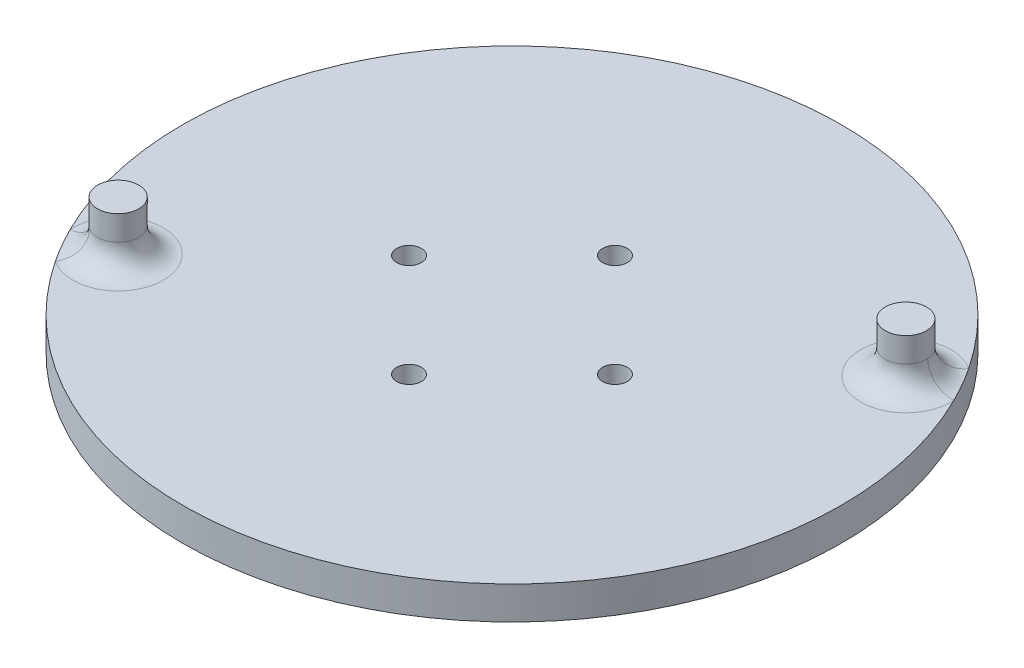
ISO-10303-21;
HEADER;
FILE_DESCRIPTION(('STEP AP214'),'2;1');
FILE_NAME('part.step','',(''),(''),'','','');
FILE_SCHEMA(('AUTOMOTIVE_DESIGN { 1 0 10303 214 1 1 1 1 }'));
ENDSEC;
DATA;
#1=APPLICATION_CONTEXT('core data for automotive mechanical design processes');
#2=APPLICATION_PROTOCOL_DEFINITION('international standard','automotive_design',2000,#1);
#3=PRODUCT_CONTEXT('',#1,'mechanical');
#4=PRODUCT('Part','Part','',(#3));
#5=PRODUCT_RELATED_PRODUCT_CATEGORY('part','',(#4));
#6=PRODUCT_DEFINITION_FORMATION('','',#4);
#7=PRODUCT_DEFINITION_CONTEXT('part definition',#1,'design');
#8=PRODUCT_DEFINITION('design','',#6,#7);
#9=PRODUCT_DEFINITION_SHAPE('','',#8);
#10=(LENGTH_UNIT() NAMED_UNIT(*) SI_UNIT(.MILLI.,.METRE.));
#11=(NAMED_UNIT(*) PLANE_ANGLE_UNIT() SI_UNIT($,.RADIAN.));
#12=(NAMED_UNIT(*) SI_UNIT($,.STERADIAN.) SOLID_ANGLE_UNIT());
#13=UNCERTAINTY_MEASURE_WITH_UNIT(LENGTH_MEASURE(1.E-05),#10,'distance_accuracy_value','');
#14=(GEOMETRIC_REPRESENTATION_CONTEXT(3) GLOBAL_UNCERTAINTY_ASSIGNED_CONTEXT((#13)) GLOBAL_UNIT_ASSIGNED_CONTEXT((#10,
#11,#12)) REPRESENTATION_CONTEXT('',''));
#15=CARTESIAN_POINT('',(0.,0.,0.));
#16=DIRECTION('',(0.,0.,1.));
#17=DIRECTION('',(1.,0.,0.));
#18=AXIS2_PLACEMENT_3D('',#15,#16,#17);
#19=CARTESIAN_POINT('',(0.,4.,0.));
#20=DIRECTION('',(0.,1.,0.));
#21=DIRECTION('',(0.,0.,1.));
#22=AXIS2_PLACEMENT_3D('',#19,#20,#21);
#23=PLANE('',#22);
#24=CARTESIAN_POINT('',(0.,4.,-12.5));
#25=DIRECTION('',(0.,1.,0.));
#26=DIRECTION('',(0.,0.,1.));
#27=AXIS2_PLACEMENT_3D('',#24,#25,#26);
#28=CIRCLE('',#27,1.5);
#29=CARTESIAN_POINT('',(0.,4.,-11.));
#30=VERTEX_POINT('',#29);
#31=EDGE_CURVE('E182',#30,#30,#28,.T.);
#32=ORIENTED_EDGE('',*,*,#31,.F.);
#33=EDGE_LOOP('',(#32));
#34=FACE_BOUND('',#33,.T.);
#35=CARTESIAN_POINT('',(0.,4.,12.5));
#36=DIRECTION('',(0.,1.,0.));
#37=DIRECTION('',(0.,0.,1.));
#38=AXIS2_PLACEMENT_3D('',#35,#36,#37);
#39=CIRCLE('',#38,1.5);
#40=CARTESIAN_POINT('',(0.,4.,14.));
#41=VERTEX_POINT('',#40);
#42=EDGE_CURVE('E194',#41,#41,#39,.T.);
#43=ORIENTED_EDGE('',*,*,#42,.F.);
#44=EDGE_LOOP('',(#43));
#45=FACE_BOUND('',#44,.T.);
#46=CARTESIAN_POINT('',(0.,4.,0.));
#47=DIRECTION('',(0.,1.,0.));
#48=DIRECTION('',(0.,0.,1.));
#49=AXIS2_PLACEMENT_3D('',#46,#47,#48);
#50=CIRCLE('',#49,40.);
#51=CARTESIAN_POINT('',(33.351893608478,4.,-22.0828257414843));
#52=VERTEX_POINT('',#51);
#53=CARTESIAN_POINT('',(-35.8002348837093,4.,17.8421742585159));
#54=VERTEX_POINT('',#53);
#55=EDGE_CURVE('E200',#52,#54,#50,.T.);
#56=ORIENTED_EDGE('',*,*,#55,.T.);
#57=CARTESIAN_POINT('',(-30.3108891324554,4.,17.4999999999999));
#58=DIRECTION('',(0.,1.,0.));
#59=DIRECTION('',(0.,0.,1.));
#60=AXIS2_PLACEMENT_3D('',#57,#58,#59);
#61=CIRCLE('',#60,5.5);
#62=CARTESIAN_POINT('',(-33.3518936084782,4.,22.082825741484));
#63=VERTEX_POINT('',#62);
#64=EDGE_CURVE('E105',#54,#63,#61,.F.);
#65=ORIENTED_EDGE('',*,*,#64,.T.);
#66=CARTESIAN_POINT('',(35.8002348837092,4.,-17.842174258516));
#67=VERTEX_POINT('',#66);
#68=EDGE_CURVE('E201',#63,#67,#50,.T.);
#69=ORIENTED_EDGE('',*,*,#68,.T.);
#70=CARTESIAN_POINT('',(30.3108891324553,4.,-17.5000000000002));
#71=DIRECTION('',(0.,1.,0.));
#72=DIRECTION('',(0.,0.,1.));
#73=AXIS2_PLACEMENT_3D('',#70,#71,#72);
#74=CIRCLE('',#73,5.5);
#75=EDGE_CURVE('E103',#67,#52,#74,.F.);
#76=ORIENTED_EDGE('',*,*,#75,.T.);
#77=EDGE_LOOP('',(#56,#65,#69,#76));
#78=FACE_BOUND('',#77,.T.);
#79=CARTESIAN_POINT('',(-12.5,4.,0.));
#80=DIRECTION('',(0.,1.,0.));
#81=DIRECTION('',(0.,0.,1.));
#82=AXIS2_PLACEMENT_3D('',#79,#80,#81);
#83=CIRCLE('',#82,1.5);
#84=CARTESIAN_POINT('',(-12.5,4.,1.49999999999996));
#85=VERTEX_POINT('',#84);
#86=EDGE_CURVE('E188',#85,#85,#83,.T.);
#87=ORIENTED_EDGE('',*,*,#86,.F.);
#88=EDGE_LOOP('',(#87));
#89=FACE_BOUND('',#88,.T.);
#90=CARTESIAN_POINT('',(12.5,4.,1.30930550206618E-13));
#91=DIRECTION('',(0.,1.,0.));
#92=DIRECTION('',(0.,0.,1.));
#93=AXIS2_PLACEMENT_3D('',#90,#91,#92);
#94=CIRCLE('',#93,1.5);
#95=CARTESIAN_POINT('',(12.5,4.,1.50000000000013));
#96=VERTEX_POINT('',#95);
#97=EDGE_CURVE('E176',#96,#96,#94,.T.);
#98=ORIENTED_EDGE('',*,*,#97,.F.);
#99=EDGE_LOOP('',(#98));
#100=FACE_BOUND('',#99,.T.);
#101=ADVANCED_FACE('F35',(#34,#45,#78,#89,#100),#23,.T.);
#102=CARTESIAN_POINT('',(0.,0.,0.));
#103=DIRECTION('',(0.,1.,0.));
#104=DIRECTION('',(0.,0.,1.));
#105=AXIS2_PLACEMENT_3D('',#102,#103,#104);
#106=PLANE('',#105);
#107=CARTESIAN_POINT('',(0.,0.,0.));
#108=DIRECTION('',(0.,1.,0.));
#109=DIRECTION('',(0.,0.,1.));
#110=AXIS2_PLACEMENT_3D('',#107,#108,#109);
#111=CIRCLE('',#110,40.);
#112=CARTESIAN_POINT('',(0.,0.,40.));
#113=VERTEX_POINT('',#112);
#114=EDGE_CURVE('E197',#113,#113,#111,.T.);
#115=ORIENTED_EDGE('',*,*,#114,.F.);
#116=EDGE_LOOP('',(#115));
#117=FACE_BOUND('',#116,.T.);
#118=CARTESIAN_POINT('',(0.,0.,12.5));
#119=DIRECTION('',(0.,1.,0.));
#120=DIRECTION('',(0.,0.,1.));
#121=AXIS2_PLACEMENT_3D('',#118,#119,#120);
#122=CIRCLE('',#121,1.5);
#123=CARTESIAN_POINT('',(0.,0.,14.));
#124=VERTEX_POINT('',#123);
#125=EDGE_CURVE('E191',#124,#124,#122,.T.);
#126=ORIENTED_EDGE('',*,*,#125,.T.);
#127=EDGE_LOOP('',(#126));
#128=FACE_BOUND('',#127,.T.);
#129=CARTESIAN_POINT('',(-12.5,0.,0.));
#130=DIRECTION('',(0.,1.,0.));
#131=DIRECTION('',(0.,0.,1.));
#132=AXIS2_PLACEMENT_3D('',#129,#130,#131);
#133=CIRCLE('',#132,1.5);
#134=CARTESIAN_POINT('',(-12.5,0.,1.49999999999996));
#135=VERTEX_POINT('',#134);
#136=EDGE_CURVE('E185',#135,#135,#133,.T.);
#137=ORIENTED_EDGE('',*,*,#136,.T.);
#138=EDGE_LOOP('',(#137));
#139=FACE_BOUND('',#138,.T.);
#140=CARTESIAN_POINT('',(0.,0.,-12.5));
#141=DIRECTION('',(0.,1.,0.));
#142=DIRECTION('',(0.,0.,1.));
#143=AXIS2_PLACEMENT_3D('',#140,#141,#142);
#144=CIRCLE('',#143,1.5);
#145=CARTESIAN_POINT('',(0.,0.,-11.));
#146=VERTEX_POINT('',#145);
#147=EDGE_CURVE('E179',#146,#146,#144,.T.);
#148=ORIENTED_EDGE('',*,*,#147,.T.);
#149=EDGE_LOOP('',(#148));
#150=FACE_BOUND('',#149,.T.);
#151=CARTESIAN_POINT('',(12.5,0.,1.30930550206618E-13));
#152=DIRECTION('',(0.,1.,0.));
#153=DIRECTION('',(0.,0.,1.));
#154=AXIS2_PLACEMENT_3D('',#151,#152,#153);
#155=CIRCLE('',#154,1.5);
#156=CARTESIAN_POINT('',(12.5,0.,1.50000000000013));
#157=VERTEX_POINT('',#156);
#158=EDGE_CURVE('E173',#157,#157,#155,.T.);
#159=ORIENTED_EDGE('',*,*,#158,.T.);
#160=EDGE_LOOP('',(#159));
#161=FACE_BOUND('',#160,.T.);
#162=ADVANCED_FACE('F224',(#117,#128,#139,#150,#161),#106,.F.);
#163=CARTESIAN_POINT('',(0.,4.,0.));
#164=DIRECTION('',(0.,-1.,0.));
#165=DIRECTION('',(0.,0.,-1.));
#166=AXIS2_PLACEMENT_3D('',#163,#164,#165);
#167=CYLINDRICAL_SURFACE('',#166,40.);
#168=EDGE_CURVE('E99',#67,#52,#50,.T.);
#169=ORIENTED_EDGE('',*,*,#168,.F.);
#170=ORIENTED_EDGE('',*,*,#68,.F.);
#171=EDGE_CURVE('E89',#54,#63,#50,.T.);
#172=ORIENTED_EDGE('',*,*,#171,.F.);
#173=ORIENTED_EDGE('',*,*,#55,.F.);
#174=EDGE_LOOP('',(#169,#170,#172,#173));
#175=FACE_BOUND('',#174,.T.);
#176=ORIENTED_EDGE('',*,*,#114,.T.);
#177=EDGE_LOOP('',(#176));
#178=FACE_BOUND('',#177,.T.);
#179=ADVANCED_FACE('F121',(#175,#178),#167,.T.);
#180=CARTESIAN_POINT('',(0.,4.,12.5));
#181=DIRECTION('',(0.,-1.,0.));
#182=DIRECTION('',(0.,0.,-1.));
#183=AXIS2_PLACEMENT_3D('',#180,#181,#182);
#184=CYLINDRICAL_SURFACE('',#183,1.5);
#185=ORIENTED_EDGE('',*,*,#42,.T.);
#186=EDGE_LOOP('',(#185));
#187=FACE_BOUND('',#186,.T.);
#188=ORIENTED_EDGE('',*,*,#125,.F.);
#189=EDGE_LOOP('',(#188));
#190=FACE_BOUND('',#189,.T.);
#191=ADVANCED_FACE('F234',(#187,#190),#184,.F.);
#192=CARTESIAN_POINT('',(-12.5,4.,0.));
#193=DIRECTION('',(0.,-1.,0.));
#194=DIRECTION('',(0.,0.,-1.));
#195=AXIS2_PLACEMENT_3D('',#192,#193,#194);
#196=CYLINDRICAL_SURFACE('',#195,1.5);
#197=ORIENTED_EDGE('',*,*,#86,.T.);
#198=EDGE_LOOP('',(#197));
#199=FACE_BOUND('',#198,.T.);
#200=ORIENTED_EDGE('',*,*,#136,.F.);
#201=EDGE_LOOP('',(#200));
#202=FACE_BOUND('',#201,.T.);
#203=ADVANCED_FACE('F238',(#199,#202),#196,.F.);
#204=CARTESIAN_POINT('',(0.,4.,-12.5));
#205=DIRECTION('',(0.,-1.,0.));
#206=DIRECTION('',(0.,0.,-1.));
#207=AXIS2_PLACEMENT_3D('',#204,#205,#206);
#208=CYLINDRICAL_SURFACE('',#207,1.5);
#209=ORIENTED_EDGE('',*,*,#31,.T.);
#210=EDGE_LOOP('',(#209));
#211=FACE_BOUND('',#210,.T.);
#212=ORIENTED_EDGE('',*,*,#147,.F.);
#213=EDGE_LOOP('',(#212));
#214=FACE_BOUND('',#213,.T.);
#215=ADVANCED_FACE('F241',(#211,#214),#208,.F.);
#216=CARTESIAN_POINT('',(12.5,4.,1.30930550206618E-13));
#217=DIRECTION('',(0.,-1.,0.));
#218=DIRECTION('',(0.,0.,-1.));
#219=AXIS2_PLACEMENT_3D('',#216,#217,#218);
#220=CYLINDRICAL_SURFACE('',#219,1.5);
#221=ORIENTED_EDGE('',*,*,#97,.T.);
#222=EDGE_LOOP('',(#221));
#223=FACE_BOUND('',#222,.T.);
#224=ORIENTED_EDGE('',*,*,#158,.F.);
#225=EDGE_LOOP('',(#224));
#226=FACE_BOUND('',#225,.T.);
#227=ADVANCED_FACE('F159',(#223,#226),#220,.F.);
#228=CARTESIAN_POINT('',(30.3108891324553,10.,-17.5000000000002));
#229=DIRECTION('',(0.,-1.,0.));
#230=DIRECTION('',(0.,0.,-1.));
#231=AXIS2_PLACEMENT_3D('',#228,#229,#230);
#232=CYLINDRICAL_SURFACE('',#231,2.5);
#233=CARTESIAN_POINT('',(30.3108891324553,7.,-17.5000000000002));
#234=DIRECTION('',(0.,1.,0.));
#235=DIRECTION('',(0.,0.,1.));
#236=AXIS2_PLACEMENT_3D('',#233,#234,#235);
#237=CIRCLE('',#236,2.5);
#238=CARTESIAN_POINT('',(31.6931638942838,7.,-19.5831026097657));
#239=VERTEX_POINT('',#238);
#240=CARTESIAN_POINT('',(32.8060462921161,7.,-17.655533753871));
#241=VERTEX_POINT('',#240);
#242=EDGE_CURVE('E48',#239,#241,#237,.T.);
#243=ORIENTED_EDGE('',*,*,#242,.T.);
#244=CARTESIAN_POINT('',(32.7900980421817,6.95988454325416,-17.1782498144012));
#245=CARTESIAN_POINT('',(32.829343833165,3.52855972586319,-17.4806537259757));
#246=CARTESIAN_POINT('',(36.2077537930057,4.,-16.9999578018618));
#247=CARTESIAN_POINT('',(32.7984393411925,6.97249814485793,-17.2424313256942));
#248=CARTESIAN_POINT('',(32.8216368819729,3.60357080085117,-17.4806354709631));
#249=CARTESIAN_POINT('',(36.1561172683221,4.,-17.1099477020297));
#250=CARTESIAN_POINT('',(32.8042797060119,6.98147980733672,-17.3070488288374));
#251=CARTESIAN_POINT('',(32.8175174351204,3.67515025466329,-17.4919603018832));
#252=CARTESIAN_POINT('',(36.1028997271764,4.,-17.2219815810571));
#253=CARTESIAN_POINT('',(32.8109228262008,6.99391764386403,-17.4366035244584));
#254=CARTESIAN_POINT('',(32.8122204232696,3.80803486217455,-17.5333343876834));
#255=CARTESIAN_POINT('',(35.9935810524816,4.,-17.4492955711121));
#256=CARTESIAN_POINT('',(32.8117297068167,6.99737834094753,-17.5015404114832));
#257=CARTESIAN_POINT('',(32.8109770688773,3.86965489312187,-17.5630207801374));
#258=CARTESIAN_POINT('',(35.9374823182773,4.,-17.5645729460346));
#259=CARTESIAN_POINT('',(32.8082857513596,7.00052590272815,-17.6312185903277));
#260=CARTESIAN_POINT('',(32.8072687742871,3.98178061009977,-17.6369613758325));
#261=CARTESIAN_POINT('',(35.8226561231657,4.,-17.7975894711439));
#262=CARTESIAN_POINT('',(32.8040403593206,7.00021682619641,-17.6959600174571));
#263=CARTESIAN_POINT('',(32.8048233500788,4.03260785485582,-17.6810121818325));
#264=CARTESIAN_POINT('',(35.7639315572763,4.,-17.9153258374596));
#265=CARTESIAN_POINT('',(32.7905325127962,6.99730155539164,-17.8249178897889));
#266=CARTESIAN_POINT('',(32.796039498903,4.12367824510925,-17.7796999305418));
#267=CARTESIAN_POINT('',(35.6439775043479,4.,-18.1528113953481));
#268=CARTESIAN_POINT('',(32.7812689918401,6.99469487274928,-17.8891342204502));
#269=CARTESIAN_POINT('',(32.7897498589996,4.16418834761344,-17.8342916117754));
#270=CARTESIAN_POINT('',(35.5827474873998,4.,-18.2725610095397));
#271=CARTESIAN_POINT('',(32.7575910978042,6.98840245258182,-18.0176774743175));
#272=CARTESIAN_POINT('',(32.7714040142321,4.23594029143109,-17.9515197924578));
#273=CARTESIAN_POINT('',(35.4569661699216,4.,-18.51546813566));
#274=CARTESIAN_POINT('',(32.7430955236307,6.98469987983506,-18.0819892595686));
#275=CARTESIAN_POINT('',(32.7593036727554,4.2672531110514,-18.0143463196952));
#276=CARTESIAN_POINT('',(35.3923770819443,4.,-18.6386494099286));
#277=CARTESIAN_POINT('',(32.7090714325865,6.97732567754129,-18.2092679150083));
#278=CARTESIAN_POINT('',(32.7283290706217,4.3206382622671,-18.1441687203171));
#279=CARTESIAN_POINT('',(35.2610176635985,4.,-18.8859799810528));
#280=CARTESIAN_POINT('',(32.6895428906256,6.97365404814863,-18.2722347784906));
#281=CARTESIAN_POINT('',(32.7094787166432,4.34287793580954,-18.2113059082781));
#282=CARTESIAN_POINT('',(35.1942473223575,4.,-19.0101292827313));
#283=CARTESIAN_POINT('',(32.6455716945012,6.96718036817315,-18.3964355701894));
#284=CARTESIAN_POINT('',(32.664695449642,4.37893184957413,-18.3470040311073));
#285=CARTESIAN_POINT('',(35.058751153487,4.,-19.2588686810666));
#286=CARTESIAN_POINT('',(32.621129295502,6.96437827245683,-18.4576695882001));
#287=CARTESIAN_POINT('',(32.6387468321734,4.39285855263276,-18.4157541279174));
#288=CARTESIAN_POINT('',(34.9900254275546,4.,-19.3834587545053));
#289=CARTESIAN_POINT('',(32.5674906697231,6.9602020968889,-18.5780015258882));
#290=CARTESIAN_POINT('',(32.5800197986632,4.41287719287661,-18.5522761044569));
#291=CARTESIAN_POINT('',(34.8508934665319,4.,-19.6325129498042));
#292=CARTESIAN_POINT('',(32.5382962151238,6.95882748609142,-18.6371002318843));
#293=CARTESIAN_POINT('',(32.5471829226423,4.41903354960386,-18.6202576761982));
#294=CARTESIAN_POINT('',(34.7804878662372,4.,-19.7569771012796));
#295=CARTESIAN_POINT('',(32.4732943058867,6.95772902051146,-18.7565510339523));
#296=CARTESIAN_POINT('',(32.4730735797803,4.42397901356556,-18.7575009883884));
#297=CARTESIAN_POINT('',(34.633651111931,4.,-20.0133308524388));
#298=CARTESIAN_POINT('',(32.4371814925475,6.95811753590883,-18.8167374885722));
#299=CARTESIAN_POINT('',(32.4312691607425,4.42228338423946,-18.8268070075059));
#300=CARTESIAN_POINT('',(34.5571245123696,4.,-20.1451807515404));
#301=CARTESIAN_POINT('',(32.360028357926,6.96072606819365,-18.9338571879158));
#302=CARTESIAN_POINT('',(32.3421728625614,4.41034313444117,-18.9598648290607));
#303=CARTESIAN_POINT('',(34.4028189843198,4.,-20.4075773905841));
#304=CARTESIAN_POINT('',(32.3189878421499,6.96294615739258,-18.9907903041011));
#305=CARTESIAN_POINT('',(32.2947131867744,4.40005674841074,-19.023833298412));
#306=CARTESIAN_POINT('',(34.3250400065056,4.,-20.5381240788688));
#307=CARTESIAN_POINT('',(32.2322457645719,6.9687401219876,-19.1010345161263));
#308=CARTESIAN_POINT('',(32.1963099938032,4.37051188366975,-19.1445011284337));
#309=CARTESIAN_POINT('',(34.1685659388611,4.,-20.79740476269));
#310=CARTESIAN_POINT('',(32.1865410442256,6.97231491928124,-19.1543431162315));
#311=CARTESIAN_POINT('',(32.1451755607156,4.35114376746601,-19.2013584235756));
#312=CARTESIAN_POINT('',(34.0898702606304,4.,-20.9261374617684));
#313=CARTESIAN_POINT('',(32.0908158900714,6.97996287932816,-19.2569241837507));
#314=CARTESIAN_POINT('',(32.0421349731095,4.30269522949262,-19.306379190878));
#315=CARTESIAN_POINT('',(33.9320195488443,4.,-21.1811363368009));
#316=CARTESIAN_POINT('',(32.040795465823,6.98403604097754,-19.3061966601044));
#317=CARTESIAN_POINT('',(31.9900503920926,4.27344307186269,-19.354635446654));
#318=CARTESIAN_POINT('',(33.8528645163068,4.,-21.3074025182176));
#319=CARTESIAN_POINT('',(31.9368663739103,6.991478733607,-19.4002902813455));
#320=CARTESIAN_POINT('',(31.888629922494,4.20433654977927,-19.4414383308371));
#321=CARTESIAN_POINT('',(33.6946446843231,4.,-21.5567316834433));
#322=CARTESIAN_POINT('',(31.8829641547419,6.99484939689293,-19.4451185274338));
#323=CARTESIAN_POINT('',(31.8391630130967,4.16425337963346,-19.4800148096572));
#324=CARTESIAN_POINT('',(33.615579947185,4.,-21.6797995376584));
#325=CARTESIAN_POINT('',(31.7715845345423,6.99938870555053,-19.5300926056508));
#326=CARTESIAN_POINT('',(31.747211293327,4.07257815015204,-19.5471841688421));
#327=CARTESIAN_POINT('',(33.4578839581828,4.,-21.9223843495277));
#328=CARTESIAN_POINT('',(31.7141078900894,7.00055781528486,-19.5702394235335));
#329=CARTESIAN_POINT('',(31.7047045828023,4.02066858014394,-19.5757148731025));
#330=CARTESIAN_POINT('',(33.3792526183938,4.,-22.0419020507622));
#331=CARTESIAN_POINT('',(31.595931293307,6.99891610331131,-19.6455942099602));
#332=CARTESIAN_POINT('',(31.6320445824164,3.90466260061444,-19.6230969341727));
#333=CARTESIAN_POINT('',(33.2228461706118,4.,-22.2769476279523));
#334=CARTESIAN_POINT('',(31.5352286505421,6.9961019078165,-19.6807979640499));
#335=CARTESIAN_POINT('',(31.6020515221618,3.84017218360112,-19.6418107405725));
#336=CARTESIAN_POINT('',(33.1450718447416,4.,-22.3924720367336));
#337=CARTESIAN_POINT('',(31.4111327303296,6.98433383333173,-19.7459743790541));
#338=CARTESIAN_POINT('',(31.5609185915939,3.69978888128542,-19.6713028879981));
#339=CARTESIAN_POINT('',(32.9910255818209,4.,-22.6188222952126));
#340=CARTESIAN_POINT('',(31.3477370936014,6.97537446208544,-19.7759423303778));
#341=CARTESIAN_POINT('',(31.5501805254363,3.62349531739356,-19.6819237255698));
#342=CARTESIAN_POINT('',(32.9147550515722,4.,-22.7296438475667));
#343=CARTESIAN_POINT('',(31.28329401276,6.9622652836908,-19.8031345485577));
#344=CARTESIAN_POINT('',(31.552769813704,3.54301077075304,-19.689359352868));
#345=CARTESIAN_POINT('',(32.8395960629226,4.,-22.8377085195533));
#346=(BOUNDED_SURFACE() B_SPLINE_SURFACE(3,2,((#244,#245,#246),(#247,#248,#249),(#250,#251,
#252),(#253,#254,#255),(#256,#257,#258),(#259,#260,#261),(#262,#263,#264),(#265,#266,#267),
(#268,#269,#270),(#271,#272,#273),(#274,#275,#276),(#277,#278,#279),(#280,#281,#282),(#283,#284,
#285),(#286,#287,#288),(#289,#290,#291),(#292,#293,#294),(#295,#296,#297),(#298,#299,#300),
(#301,#302,#303),(#304,#305,#306),(#307,#308,#309),(#310,#311,#312),(#313,#314,#315),(#316,#317,
#318),(#319,#320,#321),(#322,#323,#324),(#325,#326,#327),(#328,#329,#330),(#331,#332,#333),
(#334,#335,#336),(#337,#338,#339),(#340,#341,#342),(#343,#344,#345)),.UNSPECIFIED.,.F.,.F.,
.F.) B_SPLINE_SURFACE_WITH_KNOTS((4,2,2,2,2,2,2,2,2,2,2,2,2,2,2,2,4),(3,3),(0.,
0.428567518904796,0.856783754471075,1.28453898671894,1.71238516272124,2.14717906608379,
2.58197513700106,3.01674863587577,3.45136036494106,3.91404679238189,4.37675148779677,
4.83977162722945,5.30279074108,5.76505767573631,6.22722709581579,6.6897881992906,
7.15276325678669),(0.,1.),
.UNSPECIFIED.) GEOMETRIC_REPRESENTATION_ITEM() RATIONAL_B_SPLINE_SURFACE(((1.,0.656736980536047,
1.),(1.,0.664175721407507,1.),(1.,0.671446267255784,1.),(1.,0.685453994125995,1.),(1.,
0.692191607445565,1.),(1.,0.704942448067869,1.),(1.,0.710956447411565,1.),(1.,0.722138521610251,
1.),(1.,0.727306416343934,1.),(1.,0.736769079342543,1.),(1.,0.741048306268702,1.),(1.,
0.74854777728251,1.),(1.,0.751768016090762,1.),(1.,0.757093364769331,1.),(1.,0.759198532521874,
1.),(1.,0.762257930670406,1.),(1.,0.763212589013833,1.),(1.,0.76398031756306,1.),(1.,
0.763715660781964,1.),(1.,0.761870009048435,1.),(1.,0.760288962124214,1.),(1.,0.755838986610092,
1.),(1.,0.752969180755349,1.),(1.,0.745997116066684,1.),(1.,0.74189485996264,1.),(1.,
0.732548371027451,1.),(1.,0.727306004174941,1.),(1.,0.715793009356672,1.),(1.,0.709522598534468,
1.),(1.,0.696099875979956,1.),(1.,0.688946821350168,1.),(1.,0.673985949771694,1.),(1.,
0.666177552593477,1.),(1.,0.658159663427256,1.))) REPRESENTATION_ITEM('') SURFACE());
#347=CARTESIAN_POINT('',(32.7900980421817,6.95988454325416,-17.1782498144012));
#348=CARTESIAN_POINT('',(32.7984393411925,6.97249814485793,-17.2424313256942));
#349=CARTESIAN_POINT('',(32.8042797060119,6.98147980733672,-17.3070488288374));
#350=CARTESIAN_POINT('',(32.8109228262008,6.99391764386403,-17.4366035244584));
#351=CARTESIAN_POINT('',(32.8117297068167,6.99737834094753,-17.5015404114832));
#352=CARTESIAN_POINT('',(32.8082857513596,7.00052590272814,-17.6312185903277));
#353=CARTESIAN_POINT('',(32.8040403593206,7.00021682619641,-17.6959600174571));
#354=CARTESIAN_POINT('',(32.7905325127962,6.99730155539164,-17.8249178897889));
#355=CARTESIAN_POINT('',(32.7812689918401,6.99469487274928,-17.8891342204502));
#356=CARTESIAN_POINT('',(32.7575910978042,6.98840245258182,-18.0176774743175));
#357=CARTESIAN_POINT('',(32.7430955236307,6.98469987983506,-18.0819892595686));
#358=CARTESIAN_POINT('',(32.7090714325865,6.97732567754129,-18.2092679150083));
#359=CARTESIAN_POINT('',(32.6895428906256,6.97365404814863,-18.2722347784906));
#360=CARTESIAN_POINT('',(32.6455716945012,6.96718036817315,-18.3964355701894));
#361=CARTESIAN_POINT('',(32.621129295502,6.96437827245683,-18.4576695882001));
#362=CARTESIAN_POINT('',(32.5674906697231,6.9602020968889,-18.5780015258882));
#363=CARTESIAN_POINT('',(32.5382962151238,6.95882748609142,-18.6371002318843));
#364=CARTESIAN_POINT('',(32.4732943058867,6.95772902051146,-18.7565510339523));
#365=CARTESIAN_POINT('',(32.4371814925475,6.95811753590883,-18.8167374885722));
#366=CARTESIAN_POINT('',(32.360028357926,6.96072606819365,-18.9338571879158));
#367=CARTESIAN_POINT('',(32.3189878421499,6.96294615739258,-18.9907903041011));
#368=CARTESIAN_POINT('',(32.2322457645719,6.9687401219876,-19.1010345161263));
#369=CARTESIAN_POINT('',(32.1865410442256,6.97231491928124,-19.1543431162315));
#370=CARTESIAN_POINT('',(32.0908158900714,6.97996287932816,-19.2569241837507));
#371=CARTESIAN_POINT('',(32.040795465823,6.98403604097754,-19.3061966601044));
#372=CARTESIAN_POINT('',(31.9368663739103,6.991478733607,-19.4002902813455));
#373=CARTESIAN_POINT('',(31.8829641547419,6.99484939689293,-19.4451185274338));
#374=CARTESIAN_POINT('',(31.7715845345423,6.99938870555053,-19.5300926056508));
#375=CARTESIAN_POINT('',(31.7141078900894,7.00055781528486,-19.5702394235335));
#376=CARTESIAN_POINT('',(31.595931293307,6.99891610331131,-19.6455942099602));
#377=CARTESIAN_POINT('',(31.5352286505421,6.9961019078165,-19.6807979640499));
#378=CARTESIAN_POINT('',(31.4111327303296,6.98433383333173,-19.7459743790541));
#379=CARTESIAN_POINT('',(31.3477370936014,6.97537446208544,-19.7759423303778));
#380=CARTESIAN_POINT('',(31.28329401276,6.9622652836908,-19.8031345485577));
#381=B_SPLINE_CURVE_WITH_KNOTS('',3,(#347,#348,#349,#350,#351,#352,#353,#354,#355,#356,#357,
#358,#359,#360,#361,#362,#363,#364,#365,#366,#367,#368,#369,#370,#371,#372,#373,#374,#375,#376,
#377,#378,#379,#380),.UNSPECIFIED.,.F.,.F.,(4,2,2,2,2,2,2,2,2,2,2,2,2,2,2,2,4),(0.,
0.428567518904796,0.856783754471075,1.28453898671894,1.71238516272124,2.14717906608379,
2.58197513700106,3.01674863587577,3.45136036494106,3.91404679238189,4.37675148779677,
4.83977162722945,5.30279074108,5.76505767573631,6.22722709581579,6.6897881992906,
7.15276325678669),.UNSPECIFIED.);
#382=EDGE_CURVE('E11',#241,#239,#381,.T.);
#383=ORIENTED_EDGE('',*,*,#382,.T.);
#384=EDGE_LOOP('',(#243,#383));
#385=FACE_BOUND('',#384,.T.);
#386=CARTESIAN_POINT('',(30.3108891324553,10.,-17.5000000000002));
#387=DIRECTION('',(0.,1.,0.));
#388=DIRECTION('',(0.,0.,1.));
#389=AXIS2_PLACEMENT_3D('',#386,#387,#388);
#390=CIRCLE('',#389,2.5);
#391=CARTESIAN_POINT('',(30.3108891324553,10.,-15.0000000000002));
#392=VERTEX_POINT('',#391);
#393=EDGE_CURVE('E168',#392,#392,#390,.T.);
#394=ORIENTED_EDGE('',*,*,#393,.F.);
#395=EDGE_LOOP('',(#394));
#396=FACE_BOUND('',#395,.T.);
#397=ADVANCED_FACE('F154',(#385,#396),#232,.T.);
#398=CARTESIAN_POINT('',(30.3108891324553,10.,-17.5000000000002));
#399=DIRECTION('',(0.,1.,0.));
#400=DIRECTION('',(0.,0.,1.));
#401=AXIS2_PLACEMENT_3D('',#398,#399,#400);
#402=PLANE('',#401);
#403=ORIENTED_EDGE('',*,*,#393,.T.);
#404=EDGE_LOOP('',(#403));
#405=FACE_BOUND('',#404,.T.);
#406=ADVANCED_FACE('F158',(#405),#402,.T.);
#407=CARTESIAN_POINT('',(-30.3108891324554,10.,17.4999999999999));
#408=DIRECTION('',(0.,-1.,0.));
#409=DIRECTION('',(0.,0.,-1.));
#410=AXIS2_PLACEMENT_3D('',#407,#408,#409);
#411=CYLINDRICAL_SURFACE('',#410,2.5);
#412=CARTESIAN_POINT('',(-30.3108891324554,7.,17.4999999999999));
#413=DIRECTION('',(0.,1.,0.));
#414=DIRECTION('',(0.,0.,1.));
#415=AXIS2_PLACEMENT_3D('',#412,#413,#414);
#416=CIRCLE('',#415,2.5);
#417=CARTESIAN_POINT('',(-31.693163894284,7.,19.5831026097654));
#418=VERTEX_POINT('',#417);
#419=CARTESIAN_POINT('',(-32.8060462921162,7.,17.6555337538708));
#420=VERTEX_POINT('',#419);
#421=EDGE_CURVE('E96',#418,#420,#416,.T.);
#422=ORIENTED_EDGE('',*,*,#421,.T.);
#423=CARTESIAN_POINT('',(-32.7900980421818,6.95988454325416,17.1782498144009));
#424=CARTESIAN_POINT('',(-32.8293438309067,3.52855971216596,17.4806537085736));
#425=CARTESIAN_POINT('',(-36.2077538011667,4.,16.9999577844798));
#426=CARTESIAN_POINT('',(-32.7984393411927,6.97249814485793,17.242431325694));
#427=CARTESIAN_POINT('',(-32.8216368811659,3.60357079604218,17.4806354647855));
#428=CARTESIAN_POINT('',(-36.156117271252,4.,17.1099476957894));
#429=CARTESIAN_POINT('',(-32.804279706012,6.98147980733672,17.3070488288372));
#430=CARTESIAN_POINT('',(-32.8175174349059,3.67515025340245,17.4919603002481));
#431=CARTESIAN_POINT('',(-36.1028997279614,4.,17.2219815793852));
#432=CARTESIAN_POINT('',(-32.8109228262009,6.99391764386403,17.4366035244582));
#433=CARTESIAN_POINT('',(-32.8122204234807,3.80803486338388,17.5333343892751));
#434=CARTESIAN_POINT('',(-35.9935810516978,4.,17.4492955727816));
#435=CARTESIAN_POINT('',(-32.8117297068168,6.99737834094753,17.501540411483));
#436=CARTESIAN_POINT('',(-32.8109770689334,3.86965489343975,17.5630207805583));
#437=CARTESIAN_POINT('',(-35.9374823180673,4.,17.5645729464819));
#438=CARTESIAN_POINT('',(-32.8082857513597,7.00052590272814,17.6312185903275));
#439=CARTESIAN_POINT('',(-32.8072687742321,3.98178060979362,17.6369613754234));
#440=CARTESIAN_POINT('',(-35.8226561233755,4.,17.7975894706973));
#441=CARTESIAN_POINT('',(-32.8040403593208,7.00021682619641,17.6959600174569));
#442=CARTESIAN_POINT('',(-32.8048233500642,4.03260785477503,17.681012181724));
#443=CARTESIAN_POINT('',(-35.7639315573326,4.,17.9153258373395));
#444=CARTESIAN_POINT('',(-32.7905325127963,6.99730155539164,17.8249178897887));
#445=CARTESIAN_POINT('',(-32.7960394989177,4.1236782451876,17.7796999306468));
#446=CARTESIAN_POINT('',(-35.6439775042919,4.,18.1528113954675));
#447=CARTESIAN_POINT('',(-32.7812689918402,6.99469487274928,17.8891342204499));
#448=CARTESIAN_POINT('',(-32.7897498590036,4.16418834763434,17.8342916118033));
#449=CARTESIAN_POINT('',(-35.5827474873847,4.,18.2725610095719));
#450=CARTESIAN_POINT('',(-32.7575910978043,6.98840245258182,18.0176774743173));
#451=CARTESIAN_POINT('',(-32.7714040142282,4.23594029141039,17.9515197924298));
#452=CARTESIAN_POINT('',(-35.4569661699372,4.,18.5154681356269));
#453=CARTESIAN_POINT('',(-32.7430955236309,6.98469987983506,18.0819892595684));
#454=CARTESIAN_POINT('',(-32.7593036727546,4.26725311104583,18.0143463196872));
#455=CARTESIAN_POINT('',(-35.3923770819488,4.,18.6386494099191));
#456=CARTESIAN_POINT('',(-32.7090714325866,6.97732567754129,18.2092679150081));
#457=CARTESIAN_POINT('',(-32.728329070623,4.3206382622724,18.1441687203236));
#458=CARTESIAN_POINT('',(-35.2610176635947,4.,18.885979981061));
#459=CARTESIAN_POINT('',(-32.6895428906257,6.97365404814863,18.2722347784903));
#460=CARTESIAN_POINT('',(-32.7094787166435,4.34287793581095,18.2113059082798));
#461=CARTESIAN_POINT('',(-35.1942473223565,4.,19.0101292827335));
#462=CARTESIAN_POINT('',(-32.6455716945013,6.96718036817315,18.3964355701892));
#463=CARTESIAN_POINT('',(-32.6646954496419,4.37893184957269,18.3470040311049));
#464=CARTESIAN_POINT('',(-35.0587511534884,4.,19.2588686810637));
#465=CARTESIAN_POINT('',(-32.6211292955021,6.96437827245683,18.4576695881998));
#466=CARTESIAN_POINT('',(-32.6387468321739,4.39285855263229,18.4157541279157));
#467=CARTESIAN_POINT('',(-34.9900254275557,4.,19.3834587545033));
#468=CARTESIAN_POINT('',(-32.5674906697233,6.9602020968889,18.578001525888));
#469=CARTESIAN_POINT('',(-32.5800197986637,4.4128771928769,18.5522761044565));
#470=CARTESIAN_POINT('',(-34.8508934665322,4.,19.6325129498038));
#471=CARTESIAN_POINT('',(-32.5382962151239,6.95882748609142,18.6371002318841));
#472=CARTESIAN_POINT('',(-32.5471829226423,4.41903354960394,18.6202576761985));
#473=CARTESIAN_POINT('',(-34.780487866237,4.,19.75697710128));
#474=CARTESIAN_POINT('',(-32.4732943058868,6.95772902051147,18.7565510339521));
#475=CARTESIAN_POINT('',(-32.47307357978,4.42397901356548,18.7575009883887));
#476=CARTESIAN_POINT('',(-34.6336511119308,4.,20.0133308524392));
#477=CARTESIAN_POINT('',(-32.4371814925477,6.95811753590884,18.816737488572));
#478=CARTESIAN_POINT('',(-32.4312691607427,4.42228338423946,18.8268070075056));
#479=CARTESIAN_POINT('',(-34.5571245123699,4.,20.14518075154));
#480=CARTESIAN_POINT('',(-32.3600283579261,6.96072606819365,18.9338571879156));
#481=CARTESIAN_POINT('',(-32.3421728625618,4.41034313444121,18.95986482906));
#482=CARTESIAN_POINT('',(-34.4028189843202,4.,20.4075773905833));
#483=CARTESIAN_POINT('',(-32.31898784215,6.96294615739258,18.9907903041009));
#484=CARTESIAN_POINT('',(-32.2947131867746,4.40005674841074,19.0238332984117));
#485=CARTESIAN_POINT('',(-34.3250400065058,4.,20.5381240788685));
#486=CARTESIAN_POINT('',(-32.232245764572,6.9687401219876,19.1010345161261));
#487=CARTESIAN_POINT('',(-32.1963099938031,4.37051188366971,19.1445011284338));
#488=CARTESIAN_POINT('',(-34.1685659388611,4.,20.7974047626901));
#489=CARTESIAN_POINT('',(-32.1865410442257,6.97231491928124,19.1543431162313));
#490=CARTESIAN_POINT('',(-32.1451755607155,4.35114376746595,19.2013584235756));
#491=CARTESIAN_POINT('',(-34.0898702606303,4.,20.9261374617685));
#492=CARTESIAN_POINT('',(-32.0908158900715,6.97996287932816,19.2569241837505));
#493=CARTESIAN_POINT('',(-32.0421349731095,4.30269522949258,19.3063791908779));
#494=CARTESIAN_POINT('',(-33.9320195488443,4.,21.1811363368008));
#495=CARTESIAN_POINT('',(-32.0407954658231,6.98403604097754,19.3061966601042));
#496=CARTESIAN_POINT('',(-31.9900503920927,4.27344307186268,19.3546354466537));
#497=CARTESIAN_POINT('',(-33.8528645163069,4.,21.3074025182174));
#498=CARTESIAN_POINT('',(-31.9368663739104,6.991478733607,19.4002902813453));
#499=CARTESIAN_POINT('',(-31.8886299224941,4.20433654977926,19.4414383308369));
#500=CARTESIAN_POINT('',(-33.6946446843232,4.,21.5567316834431));
#501=CARTESIAN_POINT('',(-31.8829641547421,6.99484939689294,19.4451185274335));
#502=CARTESIAN_POINT('',(-31.8391630130968,4.16425337963343,19.480014809657));
#503=CARTESIAN_POINT('',(-33.6155799471851,4.,21.6797995376582));
#504=CARTESIAN_POINT('',(-31.7715845345425,6.99938870555053,19.5300926056506));
#505=CARTESIAN_POINT('',(-31.747211293327,4.07257815015196,19.547184168842));
#506=CARTESIAN_POINT('',(-33.4578839581828,4.,21.9223843495276));
#507=CARTESIAN_POINT('',(-31.7141078900896,7.00055781528486,19.5702394235333));
#508=CARTESIAN_POINT('',(-31.7047045828023,4.02066858014384,19.5757148731024));
#509=CARTESIAN_POINT('',(-33.3792526183938,4.,22.0419020507622));
#510=CARTESIAN_POINT('',(-31.5959312933071,6.99891610331131,19.64559420996));
#511=CARTESIAN_POINT('',(-31.6320445824164,3.90466260061433,19.6230969341726));
#512=CARTESIAN_POINT('',(-33.2228461706119,4.,22.2769476279522));
#513=CARTESIAN_POINT('',(-31.5352286505422,6.9961019078165,19.6807979640497));
#514=CARTESIAN_POINT('',(-31.6020515221618,3.84017218360102,19.6418107405724));
#515=CARTESIAN_POINT('',(-33.1450718447417,4.,22.3924720367335));
#516=CARTESIAN_POINT('',(-31.4111327303298,6.98433383333172,19.7459743790538));
#517=CARTESIAN_POINT('',(-31.5609185915939,3.6997888812853,19.6713028879979));
#518=CARTESIAN_POINT('',(-32.991025581821,4.,22.6188222952125));
#519=CARTESIAN_POINT('',(-31.3477370936015,6.97537446208543,19.7759423303776));
#520=CARTESIAN_POINT('',(-31.5501805254363,3.62349531739341,19.6819237255696));
#521=CARTESIAN_POINT('',(-32.9147550515722,4.,22.7296438475666));
#522=CARTESIAN_POINT('',(-31.2832940127602,6.9622652836908,19.8031345485575));
#523=CARTESIAN_POINT('',(-31.5527698137038,3.54301077075276,19.6893593528679));
#524=CARTESIAN_POINT('',(-32.8395960629226,4.,22.8377085195534));
#525=(BOUNDED_SURFACE() B_SPLINE_SURFACE(3,2,((#423,#424,#425),(#426,#427,#428),(#429,#430,
#431),(#432,#433,#434),(#435,#436,#437),(#438,#439,#440),(#441,#442,#443),(#444,#445,#446),
(#447,#448,#449),(#450,#451,#452),(#453,#454,#455),(#456,#457,#458),(#459,#460,#461),(#462,#463,
#464),(#465,#466,#467),(#468,#469,#470),(#471,#472,#473),(#474,#475,#476),(#477,#478,#479),
(#480,#481,#482),(#483,#484,#485),(#486,#487,#488),(#489,#490,#491),(#492,#493,#494),(#495,#496,
#497),(#498,#499,#500),(#501,#502,#503),(#504,#505,#506),(#507,#508,#509),(#510,#511,#512),
(#513,#514,#515),(#516,#517,#518),(#519,#520,#521),(#522,#523,#524)),.UNSPECIFIED.,.F.,.F.,
.F.) B_SPLINE_SURFACE_WITH_KNOTS((4,2,2,2,2,2,2,2,2,2,2,2,2,2,2,2,4),(3,3),(0.,
0.428567518904796,0.856783754471071,1.28453898671894,1.71238516272124,2.14717906608378,
2.58197513700105,3.01674863587576,3.45136036494105,3.91404679238189,4.37675148779677,
4.83977162722946,5.30279074108,5.76505767573632,6.2272270958158,6.6897881992906,
7.15276325678668),(0.,1.),
.UNSPECIFIED.) GEOMETRIC_REPRESENTATION_ITEM() RATIONAL_B_SPLINE_SURFACE(((1.,0.656736979225259,
1.),(1.,0.664175720936944,1.),(1.,0.671446267129729,1.),(1.,0.685453994251913,1.),(1.,
0.692191607479306,1.),(1.,0.704942448034197,1.),(1.,0.710956447402532,1.),(1.,0.722138521619278,
1.),(1.,0.727306416346375,1.),(1.,0.736769079340066,1.),(1.,0.741048306268027,1.),(1.,
0.748547777283161,1.),(1.,0.751768016090936,1.),(1.,0.75709336476915,1.),(1.,0.759198532521814,
1.),(1.,0.762257930670442,1.),(1.,0.763212589013843,1.),(1.,0.76398031756305,1.),(1.,
0.763715660781964,1.),(1.,0.76187000904844,1.),(1.,0.760288962124215,1.),(1.,0.755838986610087,
1.),(1.,0.752969180755341,1.),(1.,0.745997116066678,1.),(1.,0.741894859962638,1.),(1.,
0.73254837102745,1.),(1.,0.727306004174938,1.),(1.,0.715793009356663,1.),(1.,0.709522598534456,
1.),(1.,0.696099875979943,1.),(1.,0.688946821350158,1.),(1.,0.673985949771683,1.),(1.,
0.666177552593462,1.),(1.,0.658159663427229,1.))) REPRESENTATION_ITEM('') SURFACE());
#526=CARTESIAN_POINT('',(-32.7900980421818,6.95988454325416,17.1782498144009));
#527=CARTESIAN_POINT('',(-32.7984393411927,6.97249814485793,17.242431325694));
#528=CARTESIAN_POINT('',(-32.804279706012,6.98147980733672,17.3070488288372));
#529=CARTESIAN_POINT('',(-32.8109228262009,6.99391764386403,17.4366035244582));
#530=CARTESIAN_POINT('',(-32.8117297068168,6.99737834094753,17.501540411483));
#531=CARTESIAN_POINT('',(-32.8082857513597,7.00052590272814,17.6312185903275));
#532=CARTESIAN_POINT('',(-32.8040403593207,7.00021682619641,17.6959600174569));
#533=CARTESIAN_POINT('',(-32.7905325127963,6.99730155539164,17.8249178897887));
#534=CARTESIAN_POINT('',(-32.7812689918402,6.99469487274928,17.8891342204499));
#535=CARTESIAN_POINT('',(-32.7575910978043,6.98840245258182,18.0176774743173));
#536=CARTESIAN_POINT('',(-32.7430955236309,6.98469987983506,18.0819892595684));
#537=CARTESIAN_POINT('',(-32.7090714325866,6.97732567754129,18.2092679150081));
#538=CARTESIAN_POINT('',(-32.6895428906257,6.97365404814863,18.2722347784903));
#539=CARTESIAN_POINT('',(-32.6455716945013,6.96718036817315,18.3964355701892));
#540=CARTESIAN_POINT('',(-32.6211292955021,6.96437827245683,18.4576695881998));
#541=CARTESIAN_POINT('',(-32.5674906697233,6.9602020968889,18.578001525888));
#542=CARTESIAN_POINT('',(-32.5382962151239,6.95882748609142,18.6371002318841));
#543=CARTESIAN_POINT('',(-32.4732943058868,6.95772902051147,18.7565510339521));
#544=CARTESIAN_POINT('',(-32.4371814925477,6.95811753590884,18.816737488572));
#545=CARTESIAN_POINT('',(-32.3600283579261,6.96072606819365,18.9338571879156));
#546=CARTESIAN_POINT('',(-32.31898784215,6.96294615739258,18.9907903041009));
#547=CARTESIAN_POINT('',(-32.232245764572,6.9687401219876,19.1010345161261));
#548=CARTESIAN_POINT('',(-32.1865410442257,6.97231491928124,19.1543431162313));
#549=CARTESIAN_POINT('',(-32.0908158900715,6.97996287932816,19.2569241837505));
#550=CARTESIAN_POINT('',(-32.0407954658231,6.98403604097754,19.3061966601042));
#551=CARTESIAN_POINT('',(-31.9368663739104,6.991478733607,19.4002902813453));
#552=CARTESIAN_POINT('',(-31.8829641547421,6.99484939689293,19.4451185274335));
#553=CARTESIAN_POINT('',(-31.7715845345425,6.99938870555053,19.5300926056506));
#554=CARTESIAN_POINT('',(-31.7141078900896,7.00055781528486,19.5702394235333));
#555=CARTESIAN_POINT('',(-31.5959312933071,6.9989161033113,19.64559420996));
#556=CARTESIAN_POINT('',(-31.5352286505422,6.9961019078165,19.6807979640497));
#557=CARTESIAN_POINT('',(-31.4111327303298,6.98433383333172,19.7459743790538));
#558=CARTESIAN_POINT('',(-31.3477370936015,6.97537446208543,19.7759423303776));
#559=CARTESIAN_POINT('',(-31.2832940127602,6.9622652836908,19.8031345485575));
#560=B_SPLINE_CURVE_WITH_KNOTS('',3,(#526,#527,#528,#529,#530,#531,#532,#533,#534,#535,#536,
#537,#538,#539,#540,#541,#542,#543,#544,#545,#546,#547,#548,#549,#550,#551,#552,#553,#554,#555,
#556,#557,#558,#559),.UNSPECIFIED.,.F.,.F.,(4,2,2,2,2,2,2,2,2,2,2,2,2,2,2,2,4),(0.,
0.428567518904796,0.856783754471071,1.28453898671894,1.71238516272124,2.14717906608378,
2.58197513700105,3.01674863587576,3.45136036494105,3.91404679238189,4.37675148779677,
4.83977162722946,5.30279074108,5.76505767573632,6.2272270958158,6.6897881992906,
7.15276325678668),.UNSPECIFIED.);
#561=EDGE_CURVE('E87',#420,#418,#560,.T.);
#562=ORIENTED_EDGE('',*,*,#561,.T.);
#563=EDGE_LOOP('',(#422,#562));
#564=FACE_BOUND('',#563,.T.);
#565=CARTESIAN_POINT('',(-30.3108891324554,10.,17.4999999999999));
#566=DIRECTION('',(0.,1.,0.));
#567=DIRECTION('',(0.,0.,1.));
#568=AXIS2_PLACEMENT_3D('',#565,#566,#567);
#569=CIRCLE('',#568,2.5);
#570=CARTESIAN_POINT('',(-30.3108891324554,10.,19.9999999999999));
#571=VERTEX_POINT('',#570);
#572=EDGE_CURVE('E166',#571,#571,#569,.T.);
#573=ORIENTED_EDGE('',*,*,#572,.F.);
#574=EDGE_LOOP('',(#573));
#575=FACE_BOUND('',#574,.T.);
#576=ADVANCED_FACE('F101',(#564,#575),#411,.T.);
#577=CARTESIAN_POINT('',(-30.3108891324554,10.,17.4999999999999));
#578=DIRECTION('',(0.,1.,0.));
#579=DIRECTION('',(0.,0.,1.));
#580=AXIS2_PLACEMENT_3D('',#577,#578,#579);
#581=PLANE('',#580);
#582=ORIENTED_EDGE('',*,*,#572,.T.);
#583=EDGE_LOOP('',(#582));
#584=FACE_BOUND('',#583,.T.);
#585=ADVANCED_FACE('F147',(#584),#581,.T.);
#586=CARTESIAN_POINT('',(-30.3108891324554,7.,17.4999999999999));
#587=DIRECTION('',(0.,1.,0.));
#588=DIRECTION('',(0.,0.,1.));
#589=AXIS2_PLACEMENT_3D('',#586,#587,#588);
#590=TOROIDAL_SURFACE('',#589,5.5,3.);
#591=CARTESIAN_POINT('',(-33.3518936084782,7.,22.082825741484));
#592=DIRECTION('',(0.833241043906193,0.,0.55290990473143));
#593=DIRECTION('',(0.55290990473143,0.,-0.833241043906193));
#594=AXIS2_PLACEMENT_3D('',#591,#592,#593);
#595=CIRCLE('',#594,3.);
#596=EDGE_CURVE('E83',#63,#418,#595,.T.);
#597=ORIENTED_EDGE('',*,*,#596,.F.);
#598=ORIENTED_EDGE('',*,*,#64,.F.);
#599=CARTESIAN_POINT('',(-35.8002348837093,7.,17.8421742585159));
#600=DIRECTION('',(-0.0622135015483523,0.,-0.998062863864343));
#601=DIRECTION('',(-0.998062863864343,0.,0.0622135015483523));
#602=AXIS2_PLACEMENT_3D('',#599,#600,#601);
#603=CIRCLE('',#602,3.);
#604=EDGE_CURVE('E92',#420,#54,#603,.T.);
#605=ORIENTED_EDGE('',*,*,#604,.F.);
#606=ORIENTED_EDGE('',*,*,#421,.F.);
#607=EDGE_LOOP('',(#597,#598,#605,#606));
#608=FACE_BOUND('',#607,.T.);
#609=ADVANCED_FACE('F97',(#608),#590,.F.);
#610=ORIENTED_EDGE('',*,*,#604,.T.);
#611=ORIENTED_EDGE('',*,*,#171,.T.);
#612=ORIENTED_EDGE('',*,*,#596,.T.);
#613=ORIENTED_EDGE('',*,*,#561,.F.);
#614=EDGE_LOOP('',(#610,#611,#612,#613));
#615=FACE_BOUND('',#614,.T.);
#616=ADVANCED_FACE('F85',(#615),#525,.F.);
#617=CARTESIAN_POINT('',(30.3108891324553,7.,-17.5000000000002));
#618=DIRECTION('',(0.,1.,0.));
#619=DIRECTION('',(0.,0.,1.));
#620=AXIS2_PLACEMENT_3D('',#617,#618,#619);
#621=TOROIDAL_SURFACE('',#620,5.5,3.);
#622=CARTESIAN_POINT('',(33.351893608478,7.,-22.0828257414843));
#623=DIRECTION('',(-0.833241043906204,0.,-0.552909904731412));
#624=DIRECTION('',(-0.552909904731412,0.,0.833241043906204));
#625=AXIS2_PLACEMENT_3D('',#622,#623,#624);
#626=CIRCLE('',#625,3.);
#627=EDGE_CURVE('E61',#52,#239,#626,.T.);
#628=ORIENTED_EDGE('',*,*,#627,.F.);
#629=ORIENTED_EDGE('',*,*,#75,.F.);
#630=CARTESIAN_POINT('',(35.8002348837092,7.,-17.842174258516));
#631=DIRECTION('',(0.0622135015483431,0.,0.998062863864343));
#632=DIRECTION('',(0.998062863864343,0.,-0.0622135015483431));
#633=AXIS2_PLACEMENT_3D('',#630,#631,#632);
#634=CIRCLE('',#633,3.);
#635=EDGE_CURVE('E93',#241,#67,#634,.T.);
#636=ORIENTED_EDGE('',*,*,#635,.F.);
#637=ORIENTED_EDGE('',*,*,#242,.F.);
#638=EDGE_LOOP('',(#628,#629,#636,#637));
#639=FACE_BOUND('',#638,.T.);
#640=ADVANCED_FACE('F37',(#639),#621,.F.);
#641=ORIENTED_EDGE('',*,*,#635,.T.);
#642=ORIENTED_EDGE('',*,*,#168,.T.);
#643=ORIENTED_EDGE('',*,*,#627,.T.);
#644=ORIENTED_EDGE('',*,*,#382,.F.);
#645=EDGE_LOOP('',(#641,#642,#643,#644));
#646=FACE_BOUND('',#645,.T.);
#647=ADVANCED_FACE('F148',(#646),#346,.F.);
#648=CLOSED_SHELL('',(#101,#162,#179,#191,#203,#215,#227,#397,#406,#576,#585,#609,#616,#640,#647));
#649=MANIFOLD_SOLID_BREP('B2',#648);
#650=ADVANCED_BREP_SHAPE_REPRESENTATION('',(#18,#649),#14);
#651=SHAPE_DEFINITION_REPRESENTATION(#9,#650);
ENDSEC;
END-ISO-10303-21;
